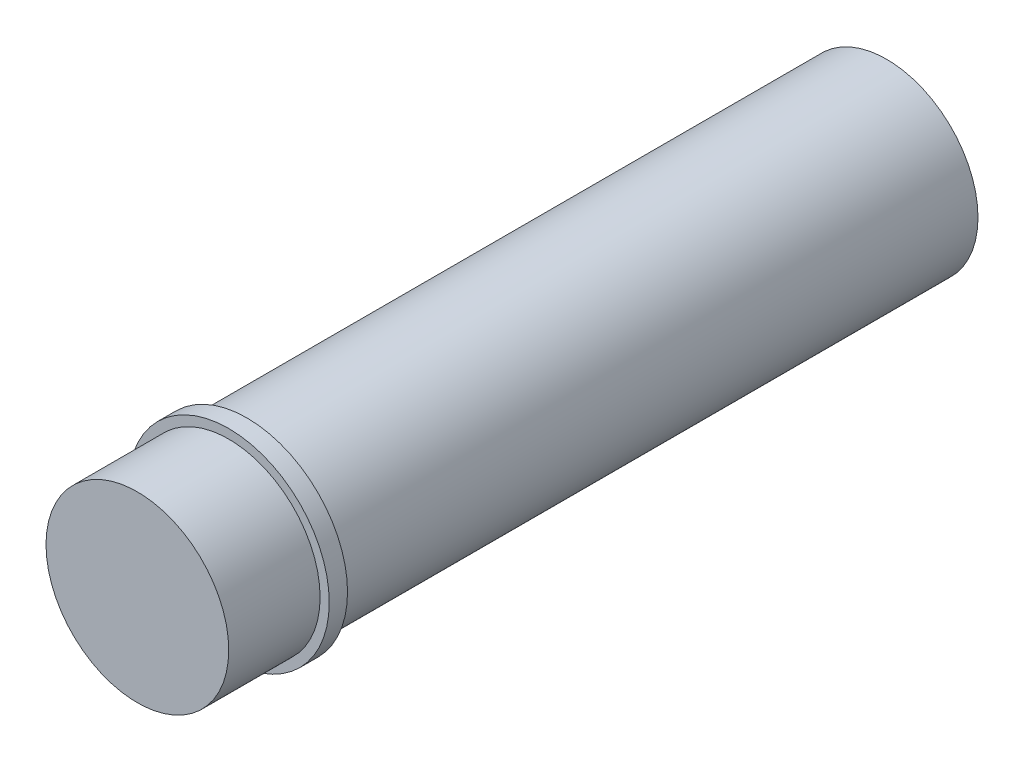
ISO-10303-21;
HEADER;
FILE_DESCRIPTION(('STEP AP214'),'2;1');
FILE_NAME('part.step','',(''),(''),'','','');
FILE_SCHEMA(('AUTOMOTIVE_DESIGN { 1 0 10303 214 1 1 1 1 }'));
ENDSEC;
DATA;
#1=APPLICATION_CONTEXT('core data for automotive mechanical design processes');
#2=APPLICATION_PROTOCOL_DEFINITION('international standard','automotive_design',2000,#1);
#3=PRODUCT_CONTEXT('',#1,'mechanical');
#4=PRODUCT('Part','Part','',(#3));
#5=PRODUCT_RELATED_PRODUCT_CATEGORY('part','',(#4));
#6=PRODUCT_DEFINITION_FORMATION('','',#4);
#7=PRODUCT_DEFINITION_CONTEXT('part definition',#1,'design');
#8=PRODUCT_DEFINITION('design','',#6,#7);
#9=PRODUCT_DEFINITION_SHAPE('','',#8);
#10=(LENGTH_UNIT() NAMED_UNIT(*) SI_UNIT(.MILLI.,.METRE.));
#11=(NAMED_UNIT(*) PLANE_ANGLE_UNIT() SI_UNIT($,.RADIAN.));
#12=(NAMED_UNIT(*) SI_UNIT($,.STERADIAN.) SOLID_ANGLE_UNIT());
#13=UNCERTAINTY_MEASURE_WITH_UNIT(LENGTH_MEASURE(1.E-05),#10,'distance_accuracy_value','');
#14=(GEOMETRIC_REPRESENTATION_CONTEXT(3) GLOBAL_UNCERTAINTY_ASSIGNED_CONTEXT((#13)) GLOBAL_UNIT_ASSIGNED_CONTEXT((#10,
#11,#12)) REPRESENTATION_CONTEXT('',''));
#15=CARTESIAN_POINT('',(0.,0.,0.));
#16=DIRECTION('',(0.,0.,1.));
#17=DIRECTION('',(1.,0.,0.));
#18=AXIS2_PLACEMENT_3D('',#15,#16,#17);
#19=CARTESIAN_POINT('',(0.,0.,88.9));
#20=DIRECTION('',(0.,0.,-1.));
#21=DIRECTION('',(-1.,0.,0.));
#22=AXIS2_PLACEMENT_3D('',#19,#20,#21);
#23=CYLINDRICAL_SURFACE('',#22,12.7);
#24=CARTESIAN_POINT('',(0.,0.,88.9));
#25=DIRECTION('',(0.,0.,1.));
#26=DIRECTION('',(1.,0.,0.));
#27=AXIS2_PLACEMENT_3D('',#24,#25,#26);
#28=CIRCLE('',#27,12.7);
#29=CARTESIAN_POINT('',(12.7,0.,88.9));
#30=VERTEX_POINT('',#29);
#31=EDGE_CURVE('E38',#30,#30,#28,.T.);
#32=ORIENTED_EDGE('',*,*,#31,.F.);
#33=EDGE_LOOP('',(#32));
#34=FACE_BOUND('',#33,.T.);
#35=CARTESIAN_POINT('',(0.,0.,0.));
#36=DIRECTION('',(0.,0.,1.));
#37=DIRECTION('',(1.,0.,0.));
#38=AXIS2_PLACEMENT_3D('',#35,#36,#37);
#39=CIRCLE('',#38,12.7);
#40=CARTESIAN_POINT('',(12.7,0.,0.));
#41=VERTEX_POINT('',#40);
#42=EDGE_CURVE('E34',#41,#41,#39,.T.);
#43=ORIENTED_EDGE('',*,*,#42,.T.);
#44=EDGE_LOOP('',(#43));
#45=FACE_BOUND('',#44,.T.);
#46=ADVANCED_FACE('F31',(#34,#45),#23,.T.);
#47=CARTESIAN_POINT('',(0.,0.,0.));
#48=DIRECTION('',(0.,0.,1.));
#49=DIRECTION('',(1.,0.,0.));
#50=AXIS2_PLACEMENT_3D('',#47,#48,#49);
#51=PLANE('',#50);
#52=ORIENTED_EDGE('',*,*,#42,.F.);
#53=EDGE_LOOP('',(#52));
#54=FACE_BOUND('',#53,.T.);
#55=ADVANCED_FACE('F72',(#54),#51,.F.);
#56=CARTESIAN_POINT('',(0.,0.,91.44));
#57=DIRECTION('',(0.,0.,-1.));
#58=DIRECTION('',(-1.,0.,0.));
#59=AXIS2_PLACEMENT_3D('',#56,#57,#58);
#60=CYLINDRICAL_SURFACE('',#59,13.97);
#61=CARTESIAN_POINT('',(0.,0.,91.44));
#62=DIRECTION('',(0.,0.,1.));
#63=DIRECTION('',(1.,0.,0.));
#64=AXIS2_PLACEMENT_3D('',#61,#62,#63);
#65=CIRCLE('',#64,13.97);
#66=CARTESIAN_POINT('',(13.97,0.,91.44));
#67=VERTEX_POINT('',#66);
#68=EDGE_CURVE('E46',#67,#67,#65,.T.);
#69=ORIENTED_EDGE('',*,*,#68,.F.);
#70=EDGE_LOOP('',(#69));
#71=FACE_BOUND('',#70,.T.);
#72=CARTESIAN_POINT('',(0.,0.,88.9));
#73=DIRECTION('',(0.,0.,1.));
#74=DIRECTION('',(1.,0.,0.));
#75=AXIS2_PLACEMENT_3D('',#72,#73,#74);
#76=CIRCLE('',#75,13.97);
#77=CARTESIAN_POINT('',(13.97,0.,88.9));
#78=VERTEX_POINT('',#77);
#79=EDGE_CURVE('E49',#78,#78,#76,.T.);
#80=ORIENTED_EDGE('',*,*,#79,.T.);
#81=EDGE_LOOP('',(#80));
#82=FACE_BOUND('',#81,.T.);
#83=ADVANCED_FACE('F77',(#71,#82),#60,.T.);
#84=CARTESIAN_POINT('',(0.,0.,91.44));
#85=DIRECTION('',(0.,0.,1.));
#86=DIRECTION('',(1.,0.,0.));
#87=AXIS2_PLACEMENT_3D('',#84,#85,#86);
#88=PLANE('',#87);
#89=CARTESIAN_POINT('',(0.,0.,91.44));
#90=DIRECTION('',(0.,0.,1.));
#91=DIRECTION('',(1.,0.,0.));
#92=AXIS2_PLACEMENT_3D('',#89,#90,#91);
#93=CIRCLE('',#92,12.7);
#94=CARTESIAN_POINT('',(12.7,0.,91.44));
#95=VERTEX_POINT('',#94);
#96=EDGE_CURVE('E10',#95,#95,#93,.T.);
#97=ORIENTED_EDGE('',*,*,#96,.F.);
#98=EDGE_LOOP('',(#97));
#99=FACE_BOUND('',#98,.T.);
#100=ORIENTED_EDGE('',*,*,#68,.T.);
#101=EDGE_LOOP('',(#100));
#102=FACE_BOUND('',#101,.T.);
#103=ADVANCED_FACE('F67',(#99,#102),#88,.T.);
#104=CARTESIAN_POINT('',(0.,0.,88.9));
#105=DIRECTION('',(0.,0.,1.));
#106=DIRECTION('',(1.,0.,0.));
#107=AXIS2_PLACEMENT_3D('',#104,#105,#106);
#108=PLANE('',#107);
#109=ORIENTED_EDGE('',*,*,#31,.T.);
#110=EDGE_LOOP('',(#109));
#111=FACE_BOUND('',#110,.T.);
#112=ORIENTED_EDGE('',*,*,#79,.F.);
#113=EDGE_LOOP('',(#112));
#114=FACE_BOUND('',#113,.T.);
#115=ADVANCED_FACE('F60',(#111,#114),#108,.F.);
#116=CARTESIAN_POINT('',(0.,0.,104.14));
#117=DIRECTION('',(0.,0.,-1.));
#118=DIRECTION('',(-1.,0.,0.));
#119=AXIS2_PLACEMENT_3D('',#116,#117,#118);
#120=CYLINDRICAL_SURFACE('',#119,12.7);
#121=CARTESIAN_POINT('',(0.,0.,104.14));
#122=DIRECTION('',(0.,0.,1.));
#123=DIRECTION('',(1.,0.,0.));
#124=AXIS2_PLACEMENT_3D('',#121,#122,#123);
#125=CIRCLE('',#124,12.7);
#126=CARTESIAN_POINT('',(12.7,0.,104.14));
#127=VERTEX_POINT('',#126);
#128=EDGE_CURVE('E45',#127,#127,#125,.T.);
#129=ORIENTED_EDGE('',*,*,#128,.F.);
#130=EDGE_LOOP('',(#129));
#131=FACE_BOUND('',#130,.T.);
#132=ORIENTED_EDGE('',*,*,#96,.T.);
#133=EDGE_LOOP('',(#132));
#134=FACE_BOUND('',#133,.T.);
#135=ADVANCED_FACE('F58',(#131,#134),#120,.T.);
#136=CARTESIAN_POINT('',(0.,0.,104.14));
#137=DIRECTION('',(0.,0.,1.));
#138=DIRECTION('',(1.,0.,0.));
#139=AXIS2_PLACEMENT_3D('',#136,#137,#138);
#140=PLANE('',#139);
#141=ORIENTED_EDGE('',*,*,#128,.T.);
#142=EDGE_LOOP('',(#141));
#143=FACE_BOUND('',#142,.T.);
#144=ADVANCED_FACE('F56',(#143),#140,.T.);
#145=CLOSED_SHELL('',(#46,#55,#83,#103,#115,#135,#144));
#146=MANIFOLD_SOLID_BREP('B2',#145);
#147=ADVANCED_BREP_SHAPE_REPRESENTATION('',(#18,#146),#14);
#148=SHAPE_DEFINITION_REPRESENTATION(#9,#147);
ENDSEC;
END-ISO-10303-21;
